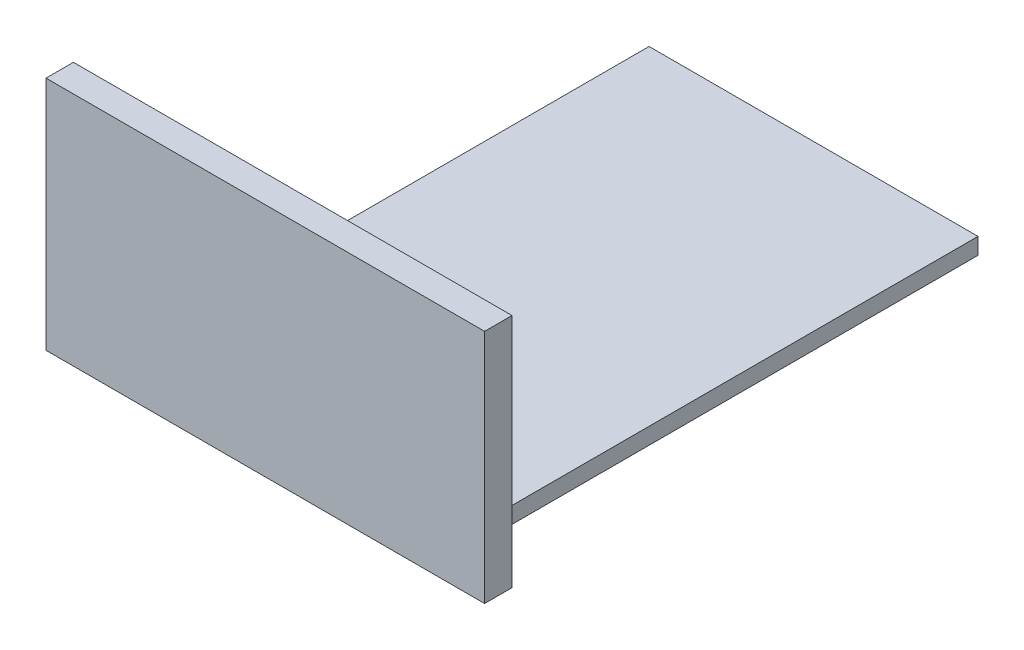
ISO-10303-21;
HEADER;
FILE_DESCRIPTION(('STEP AP214'),'2;1');
FILE_NAME('part.step','',(''),(''),'','','');
FILE_SCHEMA(('AUTOMOTIVE_DESIGN { 1 0 10303 214 1 1 1 1 }'));
ENDSEC;
DATA;
#1=APPLICATION_CONTEXT('core data for automotive mechanical design processes');
#2=APPLICATION_PROTOCOL_DEFINITION('international standard','automotive_design',2000,#1);
#3=PRODUCT_CONTEXT('',#1,'mechanical');
#4=PRODUCT('Part','Part','',(#3));
#5=PRODUCT_RELATED_PRODUCT_CATEGORY('part','',(#4));
#6=PRODUCT_DEFINITION_FORMATION('','',#4);
#7=PRODUCT_DEFINITION_CONTEXT('part definition',#1,'design');
#8=PRODUCT_DEFINITION('design','',#6,#7);
#9=PRODUCT_DEFINITION_SHAPE('','',#8);
#10=(LENGTH_UNIT() NAMED_UNIT(*) SI_UNIT(.MILLI.,.METRE.));
#11=(NAMED_UNIT(*) PLANE_ANGLE_UNIT() SI_UNIT($,.RADIAN.));
#12=(NAMED_UNIT(*) SI_UNIT($,.STERADIAN.) SOLID_ANGLE_UNIT());
#13=UNCERTAINTY_MEASURE_WITH_UNIT(LENGTH_MEASURE(1.E-05),#10,'distance_accuracy_value','');
#14=(GEOMETRIC_REPRESENTATION_CONTEXT(3) GLOBAL_UNCERTAINTY_ASSIGNED_CONTEXT((#13)) GLOBAL_UNIT_ASSIGNED_CONTEXT((#10,
#11,#12)) REPRESENTATION_CONTEXT('',''));
#15=CARTESIAN_POINT('',(0.,0.,0.));
#16=DIRECTION('',(0.,0.,1.));
#17=DIRECTION('',(1.,0.,0.));
#18=AXIS2_PLACEMENT_3D('',#15,#16,#17);
#19=CARTESIAN_POINT('',(-30.,3.,-50.));
#20=DIRECTION('',(1.,0.,0.));
#21=DIRECTION('',(0.,0.,-1.));
#22=AXIS2_PLACEMENT_3D('',#19,#20,#21);
#23=PLANE('',#22);
#24=DIRECTION('',(0.,0.,1.));
#25=VECTOR('',#24,1.);
#26=CARTESIAN_POINT('',(-30.,0.,-50.));
#27=LINE('',#26,#25);
#28=CARTESIAN_POINT('',(-30.,0.,-50.));
#29=VERTEX_POINT('',#28);
#30=CARTESIAN_POINT('',(-30.,0.,35.));
#31=VERTEX_POINT('',#30);
#32=EDGE_CURVE('E165',#29,#31,#27,.T.);
#33=ORIENTED_EDGE('',*,*,#32,.T.);
#34=DIRECTION('',(0.,1.,0.));
#35=VECTOR('',#34,1.);
#36=CARTESIAN_POINT('',(-30.,3.,35.));
#37=LINE('',#36,#35);
#38=CARTESIAN_POINT('',(-30.,3.,35.));
#39=VERTEX_POINT('',#38);
#40=EDGE_CURVE('E199',#31,#39,#37,.T.);
#41=ORIENTED_EDGE('',*,*,#40,.T.);
#42=DIRECTION('',(0.,0.,1.));
#43=VECTOR('',#42,1.);
#44=CARTESIAN_POINT('',(-30.,3.,-50.));
#45=LINE('',#44,#43);
#46=CARTESIAN_POINT('',(-30.,3.,-50.));
#47=VERTEX_POINT('',#46);
#48=EDGE_CURVE('E166',#47,#39,#45,.T.);
#49=ORIENTED_EDGE('',*,*,#48,.F.);
#50=DIRECTION('',(0.,-1.,0.));
#51=VECTOR('',#50,1.);
#52=CARTESIAN_POINT('',(-30.,3.,-50.));
#53=LINE('',#52,#51);
#54=EDGE_CURVE('E177',#47,#29,#53,.T.);
#55=ORIENTED_EDGE('',*,*,#54,.T.);
#56=EDGE_LOOP('',(#33,#41,#49,#55));
#57=FACE_BOUND('',#56,.T.);
#58=ADVANCED_FACE('F39',(#57),#23,.F.);
#59=CARTESIAN_POINT('',(30.,3.,50.));
#60=DIRECTION('',(0.,0.,-1.));
#61=DIRECTION('',(-1.,0.,0.));
#62=AXIS2_PLACEMENT_3D('',#59,#60,#61);
#63=PLANE('',#62);
#64=DIRECTION('',(0.,1.,0.));
#65=VECTOR('',#64,1.);
#66=CARTESIAN_POINT('',(-40.,0.,50.));
#67=LINE('',#66,#65);
#68=CARTESIAN_POINT('',(-40.,0.,50.));
#69=VERTEX_POINT('',#68);
#70=CARTESIAN_POINT('',(-40.,43.,50.));
#71=VERTEX_POINT('',#70);
#72=EDGE_CURVE('E113',#69,#71,#67,.T.);
#73=ORIENTED_EDGE('',*,*,#72,.F.);
#74=DIRECTION('',(1.,0.,0.));
#75=VECTOR('',#74,1.);
#76=CARTESIAN_POINT('',(30.,0.,50.));
#77=LINE('',#76,#75);
#78=CARTESIAN_POINT('',(40.,0.,50.));
#79=VERTEX_POINT('',#78);
#80=EDGE_CURVE('E180',#69,#79,#77,.T.);
#81=ORIENTED_EDGE('',*,*,#80,.T.);
#82=DIRECTION('',(0.,1.,0.));
#83=VECTOR('',#82,1.);
#84=CARTESIAN_POINT('',(40.,0.,50.));
#85=LINE('',#84,#83);
#86=CARTESIAN_POINT('',(40.,43.,50.));
#87=VERTEX_POINT('',#86);
#88=EDGE_CURVE('E122',#79,#87,#85,.T.);
#89=ORIENTED_EDGE('',*,*,#88,.T.);
#90=DIRECTION('',(1.,0.,0.));
#91=VECTOR('',#90,1.);
#92=CARTESIAN_POINT('',(-40.,43.,50.));
#93=LINE('',#92,#91);
#94=EDGE_CURVE('E126',#71,#87,#93,.T.);
#95=ORIENTED_EDGE('',*,*,#94,.F.);
#96=EDGE_LOOP('',(#73,#81,#89,#95));
#97=FACE_BOUND('',#96,.T.);
#98=ADVANCED_FACE('F127',(#97),#63,.F.);
#99=CARTESIAN_POINT('',(30.,3.,-50.));
#100=DIRECTION('',(-1.,0.,0.));
#101=DIRECTION('',(0.,0.,1.));
#102=AXIS2_PLACEMENT_3D('',#99,#100,#101);
#103=PLANE('',#102);
#104=DIRECTION('',(0.,0.,-1.));
#105=VECTOR('',#104,1.);
#106=CARTESIAN_POINT('',(30.,3.,-50.));
#107=LINE('',#106,#105);
#108=CARTESIAN_POINT('',(30.,3.,35.));
#109=VERTEX_POINT('',#108);
#110=CARTESIAN_POINT('',(30.,3.,-50.));
#111=VERTEX_POINT('',#110);
#112=EDGE_CURVE('E170',#109,#111,#107,.T.);
#113=ORIENTED_EDGE('',*,*,#112,.F.);
#114=DIRECTION('',(0.,-1.,0.));
#115=VECTOR('',#114,1.);
#116=CARTESIAN_POINT('',(30.,3.,35.));
#117=LINE('',#116,#115);
#118=CARTESIAN_POINT('',(30.,0.,35.));
#119=VERTEX_POINT('',#118);
#120=EDGE_CURVE('E195',#109,#119,#117,.T.);
#121=ORIENTED_EDGE('',*,*,#120,.T.);
#122=DIRECTION('',(0.,0.,-1.));
#123=VECTOR('',#122,1.);
#124=CARTESIAN_POINT('',(30.,0.,-50.));
#125=LINE('',#124,#123);
#126=CARTESIAN_POINT('',(30.,0.,-50.));
#127=VERTEX_POINT('',#126);
#128=EDGE_CURVE('E183',#119,#127,#125,.T.);
#129=ORIENTED_EDGE('',*,*,#128,.T.);
#130=DIRECTION('',(0.,-1.,0.));
#131=VECTOR('',#130,1.);
#132=CARTESIAN_POINT('',(30.,3.,-50.));
#133=LINE('',#132,#131);
#134=EDGE_CURVE('E191',#111,#127,#133,.T.);
#135=ORIENTED_EDGE('',*,*,#134,.F.);
#136=EDGE_LOOP('',(#113,#121,#129,#135));
#137=FACE_BOUND('',#136,.T.);
#138=ADVANCED_FACE('F225',(#137),#103,.F.);
#139=CARTESIAN_POINT('',(30.,3.,-50.));
#140=DIRECTION('',(0.,0.,1.));
#141=DIRECTION('',(1.,0.,0.));
#142=AXIS2_PLACEMENT_3D('',#139,#140,#141);
#143=PLANE('',#142);
#144=DIRECTION('',(-1.,0.,0.));
#145=VECTOR('',#144,1.);
#146=CARTESIAN_POINT('',(30.,0.,-50.));
#147=LINE('',#146,#145);
#148=EDGE_CURVE('E171',#127,#29,#147,.T.);
#149=ORIENTED_EDGE('',*,*,#148,.T.);
#150=ORIENTED_EDGE('',*,*,#54,.F.);
#151=DIRECTION('',(-1.,0.,0.));
#152=VECTOR('',#151,1.);
#153=CARTESIAN_POINT('',(30.,3.,-50.));
#154=LINE('',#153,#152);
#155=EDGE_CURVE('E174',#111,#47,#154,.T.);
#156=ORIENTED_EDGE('',*,*,#155,.F.);
#157=ORIENTED_EDGE('',*,*,#134,.T.);
#158=EDGE_LOOP('',(#149,#150,#156,#157));
#159=FACE_BOUND('',#158,.T.);
#160=ADVANCED_FACE('F220',(#159),#143,.F.);
#161=CARTESIAN_POINT('',(0.,3.,0.));
#162=DIRECTION('',(0.,-1.,0.));
#163=DIRECTION('',(0.,0.,-1.));
#164=AXIS2_PLACEMENT_3D('',#161,#162,#163);
#165=PLANE('',#164);
#166=ORIENTED_EDGE('',*,*,#48,.T.);
#167=CARTESIAN_POINT('',(-40.,3.,35.));
#168=DIRECTION('',(0.,-1.,0.));
#169=DIRECTION('',(0.,0.,-1.));
#170=AXIS2_PLACEMENT_3D('',#167,#168,#169);
#171=CIRCLE('',#170,10.);
#172=CARTESIAN_POINT('',(-40.,3.,45.));
#173=VERTEX_POINT('',#172);
#174=EDGE_CURVE('E48',#39,#173,#171,.T.);
#175=ORIENTED_EDGE('',*,*,#174,.T.);
#176=DIRECTION('',(1.,0.,0.));
#177=VECTOR('',#176,1.);
#178=CARTESIAN_POINT('',(0.,3.,45.));
#179=LINE('',#178,#177);
#180=CARTESIAN_POINT('',(40.,3.,45.));
#181=VERTEX_POINT('',#180);
#182=EDGE_CURVE('E154',#173,#181,#179,.T.);
#183=ORIENTED_EDGE('',*,*,#182,.T.);
#184=CARTESIAN_POINT('',(40.,3.,35.));
#185=DIRECTION('',(0.,-1.,0.));
#186=DIRECTION('',(0.,0.,-1.));
#187=AXIS2_PLACEMENT_3D('',#184,#185,#186);
#188=CIRCLE('',#187,10.);
#189=EDGE_CURVE('E205',#181,#109,#188,.T.);
#190=ORIENTED_EDGE('',*,*,#189,.T.);
#191=ORIENTED_EDGE('',*,*,#112,.T.);
#192=ORIENTED_EDGE('',*,*,#155,.T.);
#193=EDGE_LOOP('',(#166,#175,#183,#190,#191,#192));
#194=FACE_BOUND('',#193,.T.);
#195=ADVANCED_FACE('F209',(#194),#165,.F.);
#196=CARTESIAN_POINT('',(0.,0.,0.));
#197=DIRECTION('',(0.,-1.,0.));
#198=DIRECTION('',(0.,0.,-1.));
#199=AXIS2_PLACEMENT_3D('',#196,#197,#198);
#200=PLANE('',#199);
#201=ORIENTED_EDGE('',*,*,#128,.F.);
#202=CARTESIAN_POINT('',(40.,0.,35.));
#203=DIRECTION('',(0.,-1.,0.));
#204=DIRECTION('',(0.,0.,-1.));
#205=AXIS2_PLACEMENT_3D('',#202,#203,#204);
#206=CIRCLE('',#205,10.);
#207=CARTESIAN_POINT('',(40.,0.,45.));
#208=VERTEX_POINT('',#207);
#209=EDGE_CURVE('E202',#119,#208,#206,.F.);
#210=ORIENTED_EDGE('',*,*,#209,.T.);
#211=DIRECTION('',(0.,0.,-1.));
#212=VECTOR('',#211,1.);
#213=CARTESIAN_POINT('',(40.,0.,50.));
#214=LINE('',#213,#212);
#215=EDGE_CURVE('E123',#79,#208,#214,.T.);
#216=ORIENTED_EDGE('',*,*,#215,.F.);
#217=ORIENTED_EDGE('',*,*,#80,.F.);
#218=DIRECTION('',(0.,0.,1.));
#219=VECTOR('',#218,1.);
#220=CARTESIAN_POINT('',(-40.,0.,50.));
#221=LINE('',#220,#219);
#222=CARTESIAN_POINT('',(-40.,0.,45.));
#223=VERTEX_POINT('',#222);
#224=EDGE_CURVE('E119',#223,#69,#221,.T.);
#225=ORIENTED_EDGE('',*,*,#224,.F.);
#226=CARTESIAN_POINT('',(-40.,0.,35.));
#227=DIRECTION('',(0.,-1.,0.));
#228=DIRECTION('',(0.,0.,-1.));
#229=AXIS2_PLACEMENT_3D('',#226,#227,#228);
#230=CIRCLE('',#229,10.);
#231=EDGE_CURVE('E11',#223,#31,#230,.F.);
#232=ORIENTED_EDGE('',*,*,#231,.T.);
#233=ORIENTED_EDGE('',*,*,#32,.F.);
#234=ORIENTED_EDGE('',*,*,#148,.F.);
#235=EDGE_LOOP('',(#201,#210,#216,#217,#225,#232,#233,#234));
#236=FACE_BOUND('',#235,.T.);
#237=ADVANCED_FACE('F218',(#236),#200,.T.);
#238=CARTESIAN_POINT('',(-40.,0.,45.));
#239=DIRECTION('',(0.,0.,-1.));
#240=DIRECTION('',(-1.,0.,0.));
#241=AXIS2_PLACEMENT_3D('',#238,#239,#240);
#242=PLANE('',#241);
#243=DIRECTION('',(0.,1.,0.));
#244=VECTOR('',#243,1.);
#245=CARTESIAN_POINT('',(40.,0.,45.));
#246=LINE('',#245,#244);
#247=CARTESIAN_POINT('',(40.,43.,45.));
#248=VERTEX_POINT('',#247);
#249=EDGE_CURVE('E160',#181,#248,#246,.T.);
#250=ORIENTED_EDGE('',*,*,#249,.F.);
#251=ORIENTED_EDGE('',*,*,#182,.F.);
#252=DIRECTION('',(0.,1.,0.));
#253=VECTOR('',#252,1.);
#254=CARTESIAN_POINT('',(-40.,0.,45.));
#255=LINE('',#254,#253);
#256=CARTESIAN_POINT('',(-40.,43.,45.));
#257=VERTEX_POINT('',#256);
#258=EDGE_CURVE('E155',#173,#257,#255,.T.);
#259=ORIENTED_EDGE('',*,*,#258,.T.);
#260=DIRECTION('',(-1.,0.,0.));
#261=VECTOR('',#260,1.);
#262=CARTESIAN_POINT('',(-40.,43.,45.));
#263=LINE('',#262,#261);
#264=EDGE_CURVE('E138',#248,#257,#263,.T.);
#265=ORIENTED_EDGE('',*,*,#264,.F.);
#266=EDGE_LOOP('',(#250,#251,#259,#265));
#267=FACE_BOUND('',#266,.T.);
#268=ADVANCED_FACE('F234',(#267),#242,.T.);
#269=CARTESIAN_POINT('',(-40.,0.,50.));
#270=DIRECTION('',(-1.,0.,0.));
#271=DIRECTION('',(0.,0.,1.));
#272=AXIS2_PLACEMENT_3D('',#269,#270,#271);
#273=PLANE('',#272);
#274=ORIENTED_EDGE('',*,*,#72,.T.);
#275=DIRECTION('',(0.,0.,1.));
#276=VECTOR('',#275,1.);
#277=CARTESIAN_POINT('',(-40.,43.,50.));
#278=LINE('',#277,#276);
#279=EDGE_CURVE('E118',#257,#71,#278,.T.);
#280=ORIENTED_EDGE('',*,*,#279,.F.);
#281=ORIENTED_EDGE('',*,*,#258,.F.);
#282=EDGE_CURVE('E151',#223,#173,#255,.T.);
#283=ORIENTED_EDGE('',*,*,#282,.F.);
#284=ORIENTED_EDGE('',*,*,#224,.T.);
#285=EDGE_LOOP('',(#274,#280,#281,#283,#284));
#286=FACE_BOUND('',#285,.T.);
#287=ADVANCED_FACE('F115',(#286),#273,.T.);
#288=CARTESIAN_POINT('',(40.,0.,50.));
#289=DIRECTION('',(1.,0.,0.));
#290=DIRECTION('',(0.,0.,-1.));
#291=AXIS2_PLACEMENT_3D('',#288,#289,#290);
#292=PLANE('',#291);
#293=EDGE_CURVE('E156',#208,#181,#246,.T.);
#294=ORIENTED_EDGE('',*,*,#293,.T.);
#295=ORIENTED_EDGE('',*,*,#249,.T.);
#296=DIRECTION('',(0.,0.,-1.));
#297=VECTOR('',#296,1.);
#298=CARTESIAN_POINT('',(40.,43.,50.));
#299=LINE('',#298,#297);
#300=EDGE_CURVE('E133',#87,#248,#299,.T.);
#301=ORIENTED_EDGE('',*,*,#300,.F.);
#302=ORIENTED_EDGE('',*,*,#88,.F.);
#303=ORIENTED_EDGE('',*,*,#215,.T.);
#304=EDGE_LOOP('',(#294,#295,#301,#302,#303));
#305=FACE_BOUND('',#304,.T.);
#306=ADVANCED_FACE('F233',(#305),#292,.T.);
#307=CARTESIAN_POINT('',(0.,43.,0.));
#308=DIRECTION('',(0.,-1.,0.));
#309=DIRECTION('',(0.,0.,-1.));
#310=AXIS2_PLACEMENT_3D('',#307,#308,#309);
#311=PLANE('',#310);
#312=ORIENTED_EDGE('',*,*,#279,.T.);
#313=ORIENTED_EDGE('',*,*,#94,.T.);
#314=ORIENTED_EDGE('',*,*,#300,.T.);
#315=ORIENTED_EDGE('',*,*,#264,.T.);
#316=EDGE_LOOP('',(#312,#313,#314,#315));
#317=FACE_BOUND('',#316,.T.);
#318=ADVANCED_FACE('F136',(#317),#311,.F.);
#319=CARTESIAN_POINT('',(40.,3.,35.));
#320=DIRECTION('',(0.,-1.,0.));
#321=DIRECTION('',(0.,0.,-1.));
#322=AXIS2_PLACEMENT_3D('',#319,#320,#321);
#323=CYLINDRICAL_SURFACE('',#322,10.);
#324=ORIENTED_EDGE('',*,*,#189,.F.);
#325=ORIENTED_EDGE('',*,*,#293,.F.);
#326=ORIENTED_EDGE('',*,*,#209,.F.);
#327=ORIENTED_EDGE('',*,*,#120,.F.);
#328=EDGE_LOOP('',(#324,#325,#326,#327));
#329=FACE_BOUND('',#328,.T.);
#330=ADVANCED_FACE('F229',(#329),#323,.F.);
#331=CARTESIAN_POINT('',(-40.,3.,35.));
#332=DIRECTION('',(0.,1.,0.));
#333=DIRECTION('',(0.,0.,1.));
#334=AXIS2_PLACEMENT_3D('',#331,#332,#333);
#335=CYLINDRICAL_SURFACE('',#334,10.);
#336=ORIENTED_EDGE('',*,*,#231,.F.);
#337=ORIENTED_EDGE('',*,*,#282,.T.);
#338=ORIENTED_EDGE('',*,*,#174,.F.);
#339=ORIENTED_EDGE('',*,*,#40,.F.);
#340=EDGE_LOOP('',(#336,#337,#338,#339));
#341=FACE_BOUND('',#340,.T.);
#342=ADVANCED_FACE('F41',(#341),#335,.F.);
#343=CLOSED_SHELL('',(#58,#98,#138,#160,#195,#237,#268,#287,#306,#318,#330,#342));
#344=MANIFOLD_SOLID_BREP('B2',#343);
#345=ADVANCED_BREP_SHAPE_REPRESENTATION('',(#18,#344),#14);
#346=SHAPE_DEFINITION_REPRESENTATION(#9,#345);
ENDSEC;
END-ISO-10303-21;
